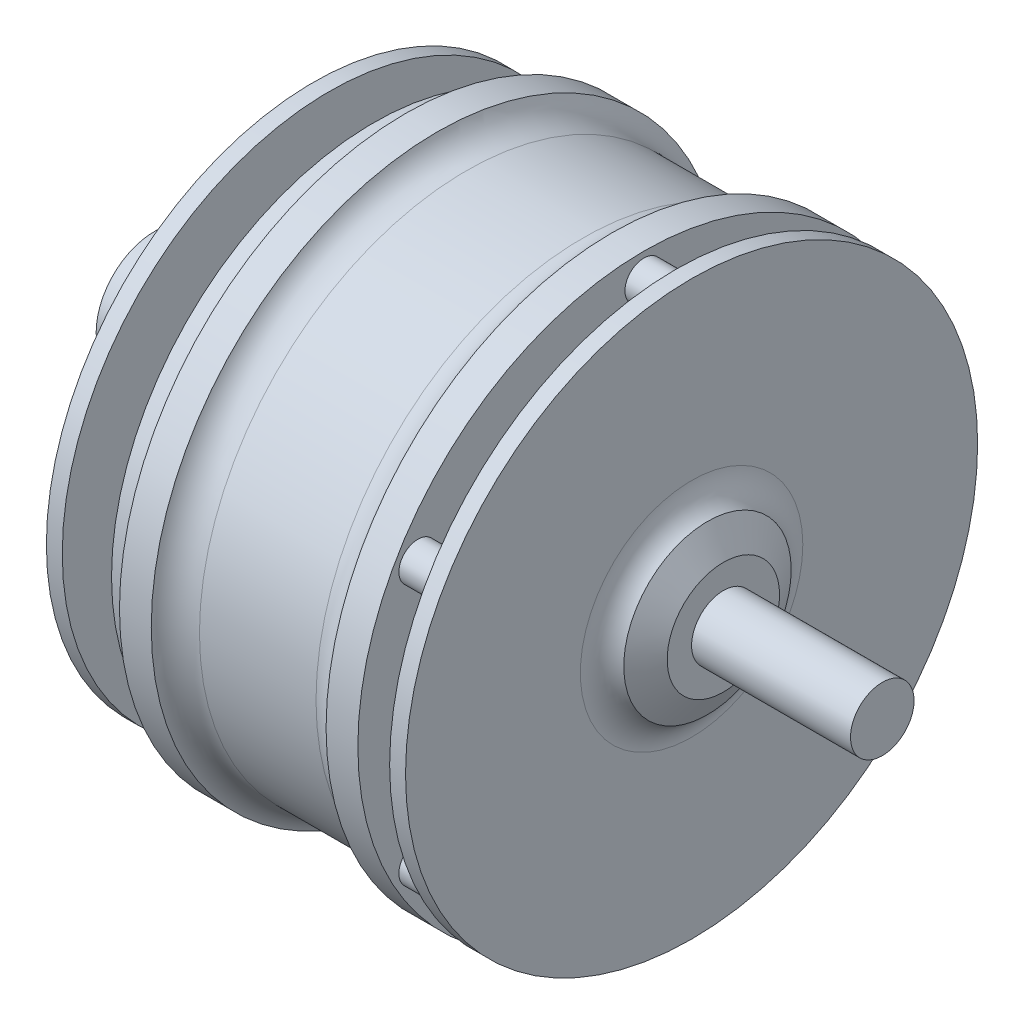
ISO-10303-21;
HEADER;
FILE_DESCRIPTION(('STEP AP214'),'2;1');
FILE_NAME('part.step','',(''),(''),'','','');
FILE_SCHEMA(('AUTOMOTIVE_DESIGN { 1 0 10303 214 1 1 1 1 }'));
ENDSEC;
DATA;
#1=APPLICATION_CONTEXT('core data for automotive mechanical design processes');
#2=APPLICATION_PROTOCOL_DEFINITION('international standard','automotive_design',2000,#1);
#3=PRODUCT_CONTEXT('',#1,'mechanical');
#4=PRODUCT('Part','Part','',(#3));
#5=PRODUCT_RELATED_PRODUCT_CATEGORY('part','',(#4));
#6=PRODUCT_DEFINITION_FORMATION('','',#4);
#7=PRODUCT_DEFINITION_CONTEXT('part definition',#1,'design');
#8=PRODUCT_DEFINITION('design','',#6,#7);
#9=PRODUCT_DEFINITION_SHAPE('','',#8);
#10=(LENGTH_UNIT() NAMED_UNIT(*) SI_UNIT(.MILLI.,.METRE.));
#11=(NAMED_UNIT(*) PLANE_ANGLE_UNIT() SI_UNIT($,.RADIAN.));
#12=(NAMED_UNIT(*) SI_UNIT($,.STERADIAN.) SOLID_ANGLE_UNIT());
#13=UNCERTAINTY_MEASURE_WITH_UNIT(LENGTH_MEASURE(1.E-05),#10,'distance_accuracy_value','');
#14=(GEOMETRIC_REPRESENTATION_CONTEXT(3) GLOBAL_UNCERTAINTY_ASSIGNED_CONTEXT((#13)) GLOBAL_UNIT_ASSIGNED_CONTEXT((#10,
#11,#12)) REPRESENTATION_CONTEXT('',''));
#15=CARTESIAN_POINT('',(0.,0.,0.));
#16=DIRECTION('',(0.,0.,1.));
#17=DIRECTION('',(1.,0.,0.));
#18=AXIS2_PLACEMENT_3D('',#15,#16,#17);
#19=CARTESIAN_POINT('',(90.,0.,0.));
#20=DIRECTION('',(1.,0.,0.));
#21=DIRECTION('',(0.,0.,-1.));
#22=AXIS2_PLACEMENT_3D('',#19,#20,#21);
#23=PLANE('',#22);
#24=CARTESIAN_POINT('',(90.,0.,0.));
#25=DIRECTION('',(1.,0.,0.));
#26=DIRECTION('',(0.,0.,-1.));
#27=AXIS2_PLACEMENT_3D('',#24,#25,#26);
#28=CIRCLE('',#27,17.6794919243111);
#29=CARTESIAN_POINT('',(90.,0.,-17.6794919243111));
#30=VERTEX_POINT('',#29);
#31=EDGE_CURVE('E44',#30,#30,#28,.T.);
#32=ORIENTED_EDGE('',*,*,#31,.T.);
#33=EDGE_LOOP('',(#32));
#34=FACE_BOUND('',#33,.T.);
#35=CARTESIAN_POINT('',(90.,0.,0.));
#36=DIRECTION('',(1.,0.,0.));
#37=DIRECTION('',(0.,0.,-1.));
#38=AXIS2_PLACEMENT_3D('',#35,#36,#37);
#39=CIRCLE('',#38,10.);
#40=CARTESIAN_POINT('',(90.,0.,-10.));
#41=VERTEX_POINT('',#40);
#42=EDGE_CURVE('E311',#41,#41,#39,.T.);
#43=ORIENTED_EDGE('',*,*,#42,.F.);
#44=EDGE_LOOP('',(#43));
#45=FACE_BOUND('',#44,.T.);
#46=ADVANCED_FACE('F37',(#34,#45),#23,.T.);
#47=CARTESIAN_POINT('',(80.,0.,0.));
#48=DIRECTION('',(1.,0.,0.));
#49=DIRECTION('',(0.,0.,-1.));
#50=AXIS2_PLACEMENT_3D('',#47,#48,#49);
#51=PLANE('',#50);
#52=CARTESIAN_POINT('',(80.,0.,0.));
#53=DIRECTION('',(1.,0.,0.));
#54=DIRECTION('',(0.,0.,-1.));
#55=AXIS2_PLACEMENT_3D('',#52,#53,#54);
#56=CIRCLE('',#55,35.);
#57=CARTESIAN_POINT('',(80.,0.,-35.));
#58=VERTEX_POINT('',#57);
#59=EDGE_CURVE('E48',#58,#58,#56,.F.);
#60=ORIENTED_EDGE('',*,*,#59,.T.);
#61=EDGE_LOOP('',(#60));
#62=FACE_BOUND('',#61,.T.);
#63=CARTESIAN_POINT('',(80.,0.,0.));
#64=DIRECTION('',(1.,0.,0.));
#65=DIRECTION('',(0.,0.,-1.));
#66=AXIS2_PLACEMENT_3D('',#63,#64,#65);
#67=CIRCLE('',#66,90.);
#68=CARTESIAN_POINT('',(80.,0.,-90.));
#69=VERTEX_POINT('',#68);
#70=EDGE_CURVE('E299',#69,#69,#67,.T.);
#71=ORIENTED_EDGE('',*,*,#70,.T.);
#72=EDGE_LOOP('',(#71));
#73=FACE_BOUND('',#72,.T.);
#74=ADVANCED_FACE('F130',(#62,#73),#51,.T.);
#75=CARTESIAN_POINT('',(65.,0.,0.));
#76=DIRECTION('',(1.,0.,0.));
#77=DIRECTION('',(0.,0.,-1.));
#78=AXIS2_PLACEMENT_3D('',#75,#76,#77);
#79=PLANE('',#78);
#80=CARTESIAN_POINT('',(65.,41.0613259833003,71.1203028292224));
#81=DIRECTION('',(1.,0.,0.));
#82=DIRECTION('',(0.,0.866025403784433,-0.50000000000001));
#83=AXIS2_PLACEMENT_3D('',#80,#81,#82);
#84=CIRCLE('',#83,5.96597399702664);
#85=CARTESIAN_POINT('',(65.,46.2280110230428,68.137315830709));
#86=VERTEX_POINT('',#85);
#87=EDGE_CURVE('E296',#86,#86,#84,.T.);
#88=ORIENTED_EDGE('',*,*,#87,.F.);
#89=EDGE_LOOP('',(#88));
#90=FACE_BOUND('',#89,.T.);
#91=CARTESIAN_POINT('',(65.,-82.122651966599,0.));
#92=DIRECTION('',(1.,0.,0.));
#93=DIRECTION('',(0.,0.,1.));
#94=AXIS2_PLACEMENT_3D('',#91,#92,#93);
#95=CIRCLE('',#94,5.96597399702664);
#96=CARTESIAN_POINT('',(65.,-82.122651966599,5.96597399702664));
#97=VERTEX_POINT('',#96);
#98=EDGE_CURVE('E284',#97,#97,#95,.T.);
#99=ORIENTED_EDGE('',*,*,#98,.F.);
#100=EDGE_LOOP('',(#99));
#101=FACE_BOUND('',#100,.T.);
#102=CARTESIAN_POINT('',(65.,41.0613259832993,-71.120302829223));
#103=DIRECTION('',(1.,0.,0.));
#104=DIRECTION('',(0.,-0.86602540378444,-0.499999999999998));
#105=AXIS2_PLACEMENT_3D('',#102,#103,#104);
#106=CIRCLE('',#105,5.96597399702664);
#107=CARTESIAN_POINT('',(65.,35.8946409435569,-74.1032898277363));
#108=VERTEX_POINT('',#107);
#109=EDGE_CURVE('E272',#108,#108,#106,.T.);
#110=ORIENTED_EDGE('',*,*,#109,.F.);
#111=EDGE_LOOP('',(#110));
#112=FACE_BOUND('',#111,.T.);
#113=CARTESIAN_POINT('',(65.,0.,0.));
#114=DIRECTION('',(1.,0.,0.));
#115=DIRECTION('',(0.,0.,-1.));
#116=AXIS2_PLACEMENT_3D('',#113,#114,#115);
#117=CIRCLE('',#116,90.);
#118=CARTESIAN_POINT('',(65.,0.,-90.));
#119=VERTEX_POINT('',#118);
#120=EDGE_CURVE('E63',#119,#119,#117,.T.);
#121=ORIENTED_EDGE('',*,*,#120,.T.);
#122=EDGE_LOOP('',(#121));
#123=FACE_BOUND('',#122,.T.);
#124=CARTESIAN_POINT('',(65.,82.122651966599,0.));
#125=DIRECTION('',(1.,0.,0.));
#126=DIRECTION('',(0.,0.,-1.));
#127=AXIS2_PLACEMENT_3D('',#124,#125,#126);
#128=CIRCLE('',#127,5.96597399702664);
#129=CARTESIAN_POINT('',(65.,82.122651966599,-5.96597399702664));
#130=VERTEX_POINT('',#129);
#131=EDGE_CURVE('E266',#130,#130,#128,.T.);
#132=ORIENTED_EDGE('',*,*,#131,.F.);
#133=EDGE_LOOP('',(#132));
#134=FACE_BOUND('',#133,.T.);
#135=CARTESIAN_POINT('',(65.,-41.0613259832999,-71.1203028292227));
#136=DIRECTION('',(1.,0.,0.));
#137=DIRECTION('',(0.,-0.866025403784436,0.500000000000004));
#138=AXIS2_PLACEMENT_3D('',#135,#136,#137);
#139=CIRCLE('',#138,5.96597399702664);
#140=CARTESIAN_POINT('',(65.,-46.2280110230423,-68.1373158307093));
#141=VERTEX_POINT('',#140);
#142=EDGE_CURVE('E278',#141,#141,#139,.T.);
#143=ORIENTED_EDGE('',*,*,#142,.F.);
#144=EDGE_LOOP('',(#143));
#145=FACE_BOUND('',#144,.T.);
#146=CARTESIAN_POINT('',(65.,-41.0613259832989,71.1203028292232));
#147=DIRECTION('',(1.,0.,0.));
#148=DIRECTION('',(0.,0.866025403784443,0.499999999999992));
#149=AXIS2_PLACEMENT_3D('',#146,#147,#148);
#150=CIRCLE('',#149,5.96597399702664);
#151=CARTESIAN_POINT('',(65.,-35.8946409435564,74.1032898277365));
#152=VERTEX_POINT('',#151);
#153=EDGE_CURVE('E290',#152,#152,#150,.T.);
#154=ORIENTED_EDGE('',*,*,#153,.F.);
#155=EDGE_LOOP('',(#154));
#156=FACE_BOUND('',#155,.T.);
#157=CARTESIAN_POINT('',(65.,0.,0.));
#158=DIRECTION('',(1.,0.,0.));
#159=DIRECTION('',(0.,0.,-1.));
#160=AXIS2_PLACEMENT_3D('',#157,#158,#159);
#161=CIRCLE('',#160,25.);
#162=CARTESIAN_POINT('',(65.,0.,-25.));
#163=VERTEX_POINT('',#162);
#164=EDGE_CURVE('E305',#163,#163,#161,.T.);
#165=ORIENTED_EDGE('',*,*,#164,.F.);
#166=EDGE_LOOP('',(#165));
#167=FACE_BOUND('',#166,.T.);
#168=ADVANCED_FACE('F126',(#90,#101,#112,#123,#134,#145,#156,#167),#79,.T.);
#169=CARTESIAN_POINT('',(75.,0.,0.));
#170=DIRECTION('',(1.,0.,0.));
#171=DIRECTION('',(0.,0.,-1.));
#172=AXIS2_PLACEMENT_3D('',#169,#170,#171);
#173=PLANE('',#172);
#174=CARTESIAN_POINT('',(75.,82.122651966599,0.));
#175=DIRECTION('',(1.,0.,0.));
#176=DIRECTION('',(0.,0.,-1.));
#177=AXIS2_PLACEMENT_3D('',#174,#175,#176);
#178=CIRCLE('',#177,5.96597399702664);
#179=CARTESIAN_POINT('',(75.,82.122651966599,-5.96597399702664));
#180=VERTEX_POINT('',#179);
#181=EDGE_CURVE('E263',#180,#180,#178,.T.);
#182=ORIENTED_EDGE('',*,*,#181,.T.);
#183=EDGE_LOOP('',(#182));
#184=FACE_BOUND('',#183,.T.);
#185=CARTESIAN_POINT('',(75.,-41.0613259832999,-71.1203028292227));
#186=DIRECTION('',(1.,0.,0.));
#187=DIRECTION('',(0.,-0.866025403784436,0.500000000000004));
#188=AXIS2_PLACEMENT_3D('',#185,#186,#187);
#189=CIRCLE('',#188,5.96597399702664);
#190=CARTESIAN_POINT('',(75.,-46.2280110230423,-68.1373158307093));
#191=VERTEX_POINT('',#190);
#192=EDGE_CURVE('E275',#191,#191,#189,.T.);
#193=ORIENTED_EDGE('',*,*,#192,.T.);
#194=EDGE_LOOP('',(#193));
#195=FACE_BOUND('',#194,.T.);
#196=CARTESIAN_POINT('',(75.,-41.0613259832989,71.1203028292232));
#197=DIRECTION('',(1.,0.,0.));
#198=DIRECTION('',(0.,0.866025403784443,0.499999999999992));
#199=AXIS2_PLACEMENT_3D('',#196,#197,#198);
#200=CIRCLE('',#199,5.96597399702664);
#201=CARTESIAN_POINT('',(75.,-35.8946409435564,74.1032898277365));
#202=VERTEX_POINT('',#201);
#203=EDGE_CURVE('E287',#202,#202,#200,.T.);
#204=ORIENTED_EDGE('',*,*,#203,.T.);
#205=EDGE_LOOP('',(#204));
#206=FACE_BOUND('',#205,.T.);
#207=CARTESIAN_POINT('',(75.,0.,0.));
#208=DIRECTION('',(1.,0.,0.));
#209=DIRECTION('',(0.,0.,-1.));
#210=AXIS2_PLACEMENT_3D('',#207,#208,#209);
#211=CIRCLE('',#210,90.);
#212=CARTESIAN_POINT('',(75.,0.,-90.));
#213=VERTEX_POINT('',#212);
#214=EDGE_CURVE('E302',#213,#213,#211,.T.);
#215=ORIENTED_EDGE('',*,*,#214,.F.);
#216=EDGE_LOOP('',(#215));
#217=FACE_BOUND('',#216,.T.);
#218=CARTESIAN_POINT('',(75.,41.0613259833003,71.1203028292224));
#219=DIRECTION('',(1.,0.,0.));
#220=DIRECTION('',(0.,0.866025403784433,-0.50000000000001));
#221=AXIS2_PLACEMENT_3D('',#218,#219,#220);
#222=CIRCLE('',#221,5.96597399702664);
#223=CARTESIAN_POINT('',(75.,46.2280110230428,68.137315830709));
#224=VERTEX_POINT('',#223);
#225=EDGE_CURVE('E293',#224,#224,#222,.T.);
#226=ORIENTED_EDGE('',*,*,#225,.T.);
#227=EDGE_LOOP('',(#226));
#228=FACE_BOUND('',#227,.T.);
#229=CARTESIAN_POINT('',(75.,-82.122651966599,0.));
#230=DIRECTION('',(1.,0.,0.));
#231=DIRECTION('',(0.,0.,1.));
#232=AXIS2_PLACEMENT_3D('',#229,#230,#231);
#233=CIRCLE('',#232,5.96597399702664);
#234=CARTESIAN_POINT('',(75.,-82.122651966599,5.96597399702664));
#235=VERTEX_POINT('',#234);
#236=EDGE_CURVE('E281',#235,#235,#233,.T.);
#237=ORIENTED_EDGE('',*,*,#236,.T.);
#238=EDGE_LOOP('',(#237));
#239=FACE_BOUND('',#238,.T.);
#240=CARTESIAN_POINT('',(75.,41.0613259832993,-71.120302829223));
#241=DIRECTION('',(1.,0.,0.));
#242=DIRECTION('',(0.,-0.86602540378444,-0.499999999999998));
#243=AXIS2_PLACEMENT_3D('',#240,#241,#242);
#244=CIRCLE('',#243,5.96597399702664);
#245=CARTESIAN_POINT('',(75.,35.8946409435569,-74.1032898277363));
#246=VERTEX_POINT('',#245);
#247=EDGE_CURVE('E269',#246,#246,#244,.T.);
#248=ORIENTED_EDGE('',*,*,#247,.T.);
#249=EDGE_LOOP('',(#248));
#250=FACE_BOUND('',#249,.T.);
#251=CARTESIAN_POINT('',(75.,0.,0.));
#252=DIRECTION('',(1.,0.,0.));
#253=DIRECTION('',(0.,0.,-1.));
#254=AXIS2_PLACEMENT_3D('',#251,#252,#253);
#255=CIRCLE('',#254,25.);
#256=CARTESIAN_POINT('',(75.,0.,-25.));
#257=VERTEX_POINT('',#256);
#258=EDGE_CURVE('E60',#257,#257,#255,.F.);
#259=ORIENTED_EDGE('',*,*,#258,.F.);
#260=EDGE_LOOP('',(#259));
#261=FACE_BOUND('',#260,.T.);
#262=ADVANCED_FACE('F129',(#184,#195,#206,#217,#228,#239,#250,#261),#173,.F.);
#263=CARTESIAN_POINT('',(-39.,0.,0.));
#264=DIRECTION('',(-1.,0.,0.));
#265=DIRECTION('',(0.,0.,1.));
#266=AXIS2_PLACEMENT_3D('',#263,#264,#265);
#267=PLANE('',#266);
#268=CARTESIAN_POINT('',(-39.,0.,0.));
#269=DIRECTION('',(-1.,0.,0.));
#270=DIRECTION('',(0.,0.,1.));
#271=AXIS2_PLACEMENT_3D('',#268,#269,#270);
#272=CIRCLE('',#271,84.);
#273=CARTESIAN_POINT('',(-39.,0.,84.));
#274=VERTEX_POINT('',#273);
#275=EDGE_CURVE('E236',#274,#274,#272,.T.);
#276=ORIENTED_EDGE('',*,*,#275,.T.);
#277=EDGE_LOOP('',(#276));
#278=FACE_BOUND('',#277,.T.);
#279=CARTESIAN_POINT('',(-39.,0.,0.));
#280=DIRECTION('',(-1.,0.,0.));
#281=DIRECTION('',(0.,0.,1.));
#282=AXIS2_PLACEMENT_3D('',#279,#280,#281);
#283=CIRCLE('',#282,18.3359588018754);
#284=CARTESIAN_POINT('',(-39.,0.,18.3359588018754));
#285=VERTEX_POINT('',#284);
#286=EDGE_CURVE('E260',#285,#285,#283,.T.);
#287=ORIENTED_EDGE('',*,*,#286,.F.);
#288=EDGE_LOOP('',(#287));
#289=FACE_BOUND('',#288,.T.);
#290=ADVANCED_FACE('F104',(#278,#289),#267,.T.);
#291=CARTESIAN_POINT('',(-29.,0.,0.));
#292=DIRECTION('',(-1.,0.,0.));
#293=DIRECTION('',(0.,0.,1.));
#294=AXIS2_PLACEMENT_3D('',#291,#292,#293);
#295=PLANE('',#294);
#296=CARTESIAN_POINT('',(-29.,0.,0.));
#297=DIRECTION('',(-1.,0.,0.));
#298=DIRECTION('',(0.,0.,1.));
#299=AXIS2_PLACEMENT_3D('',#296,#297,#298);
#300=CIRCLE('',#299,45.);
#301=CARTESIAN_POINT('',(-29.,0.,45.));
#302=VERTEX_POINT('',#301);
#303=EDGE_CURVE('E84',#302,#302,#300,.T.);
#304=ORIENTED_EDGE('',*,*,#303,.T.);
#305=EDGE_LOOP('',(#304));
#306=FACE_BOUND('',#305,.T.);
#307=CARTESIAN_POINT('',(-29.,0.,0.));
#308=DIRECTION('',(-1.,0.,0.));
#309=DIRECTION('',(0.,0.,1.));
#310=AXIS2_PLACEMENT_3D('',#307,#308,#309);
#311=CIRCLE('',#310,15.);
#312=CARTESIAN_POINT('',(-29.,0.,15.));
#313=VERTEX_POINT('',#312);
#314=EDGE_CURVE('E234',#313,#313,#311,.T.);
#315=ORIENTED_EDGE('',*,*,#314,.F.);
#316=EDGE_LOOP('',(#315));
#317=FACE_BOUND('',#316,.T.);
#318=ADVANCED_FACE('F93',(#306,#317),#295,.T.);
#319=CARTESIAN_POINT('',(-20.,0.,0.));
#320=DIRECTION('',(-1.,0.,0.));
#321=DIRECTION('',(0.,0.,1.));
#322=AXIS2_PLACEMENT_3D('',#319,#320,#321);
#323=PLANE('',#322);
#324=CARTESIAN_POINT('',(-20.,0.,0.));
#325=DIRECTION('',(-1.,0.,0.));
#326=DIRECTION('',(0.,0.,1.));
#327=AXIS2_PLACEMENT_3D('',#324,#325,#326);
#328=CIRCLE('',#327,82.5);
#329=CARTESIAN_POINT('',(-20.,0.,82.5));
#330=VERTEX_POINT('',#329);
#331=EDGE_CURVE('E73',#330,#330,#328,.T.);
#332=ORIENTED_EDGE('',*,*,#331,.T.);
#333=EDGE_LOOP('',(#332));
#334=FACE_BOUND('',#333,.T.);
#335=CARTESIAN_POINT('',(-20.,0.,0.));
#336=DIRECTION('',(-1.,0.,0.));
#337=DIRECTION('',(0.,0.,1.));
#338=AXIS2_PLACEMENT_3D('',#335,#336,#337);
#339=CIRCLE('',#338,62.5);
#340=CARTESIAN_POINT('',(-20.,0.,62.5));
#341=VERTEX_POINT('',#340);
#342=EDGE_CURVE('E79',#341,#341,#339,.T.);
#343=ORIENTED_EDGE('',*,*,#342,.F.);
#344=EDGE_LOOP('',(#343));
#345=FACE_BOUND('',#344,.T.);
#346=ADVANCED_FACE('F103',(#334,#345),#323,.T.);
#347=CARTESIAN_POINT('',(-10.,0.,0.));
#348=DIRECTION('',(-1.,0.,0.));
#349=DIRECTION('',(0.,0.,1.));
#350=AXIS2_PLACEMENT_3D('',#347,#348,#349);
#351=PLANE('',#350);
#352=CARTESIAN_POINT('',(-10.,0.,0.));
#353=DIRECTION('',(-1.,0.,0.));
#354=DIRECTION('',(0.,0.,1.));
#355=AXIS2_PLACEMENT_3D('',#352,#353,#354);
#356=CIRCLE('',#355,90.);
#357=CARTESIAN_POINT('',(-10.,0.,90.));
#358=VERTEX_POINT('',#357);
#359=EDGE_CURVE('E67',#358,#358,#356,.T.);
#360=ORIENTED_EDGE('',*,*,#359,.T.);
#361=EDGE_LOOP('',(#360));
#362=FACE_BOUND('',#361,.T.);
#363=CARTESIAN_POINT('',(-10.,0.,0.));
#364=DIRECTION('',(-1.,0.,0.));
#365=DIRECTION('',(0.,0.,1.));
#366=AXIS2_PLACEMENT_3D('',#363,#364,#365);
#367=CIRCLE('',#366,82.5);
#368=CARTESIAN_POINT('',(-10.,0.,82.5));
#369=VERTEX_POINT('',#368);
#370=EDGE_CURVE('E76',#369,#369,#367,.T.);
#371=ORIENTED_EDGE('',*,*,#370,.F.);
#372=EDGE_LOOP('',(#371));
#373=FACE_BOUND('',#372,.T.);
#374=ADVANCED_FACE('F111',(#362,#373),#351,.T.);
#375=CARTESIAN_POINT('',(55.,0.,0.));
#376=DIRECTION('',(-1.,0.,0.));
#377=DIRECTION('',(0.,0.,1.));
#378=AXIS2_PLACEMENT_3D('',#375,#376,#377);
#379=CYLINDRICAL_SURFACE('',#378,84.);
#380=CARTESIAN_POINT('',(45.8348486100883,0.,0.));
#381=DIRECTION('',(1.,0.,0.));
#382=DIRECTION('',(0.,0.,-1.));
#383=AXIS2_PLACEMENT_3D('',#380,#381,#382);
#384=CIRCLE('',#383,84.);
#385=CARTESIAN_POINT('',(45.8348486100883,0.,-84.));
#386=VERTEX_POINT('',#385);
#387=EDGE_CURVE('E52',#386,#386,#384,.F.);
#388=ORIENTED_EDGE('',*,*,#387,.T.);
#389=EDGE_LOOP('',(#388));
#390=FACE_BOUND('',#389,.T.);
#391=CARTESIAN_POINT('',(9.16515138991168,0.,0.));
#392=DIRECTION('',(-1.,0.,0.));
#393=DIRECTION('',(0.,0.,1.));
#394=AXIS2_PLACEMENT_3D('',#391,#392,#393);
#395=CIRCLE('',#394,84.);
#396=CARTESIAN_POINT('',(9.16515138991168,0.,84.));
#397=VERTEX_POINT('',#396);
#398=EDGE_CURVE('E57',#397,#397,#395,.F.);
#399=ORIENTED_EDGE('',*,*,#398,.T.);
#400=EDGE_LOOP('',(#399));
#401=FACE_BOUND('',#400,.T.);
#402=ADVANCED_FACE('F120',(#390,#401),#379,.T.);
#403=CARTESIAN_POINT('',(65.,0.,0.));
#404=DIRECTION('',(-1.,0.,0.));
#405=DIRECTION('',(0.,0.,1.));
#406=AXIS2_PLACEMENT_3D('',#403,#404,#405);
#407=CYLINDRICAL_SURFACE('',#406,90.);
#408=ORIENTED_EDGE('',*,*,#120,.F.);
#409=EDGE_LOOP('',(#408));
#410=FACE_BOUND('',#409,.T.);
#411=CARTESIAN_POINT('',(55.,0.,0.));
#412=DIRECTION('',(1.,0.,0.));
#413=DIRECTION('',(0.,0.,-1.));
#414=AXIS2_PLACEMENT_3D('',#411,#412,#413);
#415=CIRCLE('',#414,90.);
#416=CARTESIAN_POINT('',(55.,0.,-90.));
#417=VERTEX_POINT('',#416);
#418=EDGE_CURVE('E64',#417,#417,#415,.T.);
#419=ORIENTED_EDGE('',*,*,#418,.T.);
#420=EDGE_LOOP('',(#419));
#421=FACE_BOUND('',#420,.T.);
#422=ADVANCED_FACE('F124',(#410,#421),#407,.T.);
#423=CARTESIAN_POINT('',(-10.,0.,0.));
#424=DIRECTION('',(1.,0.,0.));
#425=DIRECTION('',(0.,0.,-1.));
#426=AXIS2_PLACEMENT_3D('',#423,#424,#425);
#427=CYLINDRICAL_SURFACE('',#426,90.);
#428=ORIENTED_EDGE('',*,*,#359,.F.);
#429=EDGE_LOOP('',(#428));
#430=FACE_BOUND('',#429,.T.);
#431=CARTESIAN_POINT('',(0.,0.,0.));
#432=DIRECTION('',(-1.,0.,0.));
#433=DIRECTION('',(0.,0.,1.));
#434=AXIS2_PLACEMENT_3D('',#431,#432,#433);
#435=CIRCLE('',#434,90.);
#436=CARTESIAN_POINT('',(0.,0.,90.));
#437=VERTEX_POINT('',#436);
#438=EDGE_CURVE('E70',#437,#437,#435,.T.);
#439=ORIENTED_EDGE('',*,*,#438,.T.);
#440=EDGE_LOOP('',(#439));
#441=FACE_BOUND('',#440,.T.);
#442=ADVANCED_FACE('F116',(#430,#441),#427,.T.);
#443=CARTESIAN_POINT('',(-20.,0.,0.));
#444=DIRECTION('',(1.,0.,0.));
#445=DIRECTION('',(0.,0.,-1.));
#446=AXIS2_PLACEMENT_3D('',#443,#444,#445);
#447=CYLINDRICAL_SURFACE('',#446,82.5);
#448=ORIENTED_EDGE('',*,*,#331,.F.);
#449=EDGE_LOOP('',(#448));
#450=FACE_BOUND('',#449,.T.);
#451=ORIENTED_EDGE('',*,*,#370,.T.);
#452=EDGE_LOOP('',(#451));
#453=FACE_BOUND('',#452,.T.);
#454=ADVANCED_FACE('F113',(#450,#453),#447,.T.);
#455=CARTESIAN_POINT('',(-29.,0.,0.));
#456=DIRECTION('',(1.,0.,0.));
#457=DIRECTION('',(0.,0.,-1.));
#458=AXIS2_PLACEMENT_3D('',#455,#456,#457);
#459=CONICAL_SURFACE('',#458,45.,1.0957855705298);
#460=ORIENTED_EDGE('',*,*,#342,.T.);
#461=EDGE_LOOP('',(#460));
#462=FACE_BOUND('',#461,.T.);
#463=ORIENTED_EDGE('',*,*,#303,.F.);
#464=EDGE_LOOP('',(#463));
#465=FACE_BOUND('',#464,.T.);
#466=ADVANCED_FACE('F106',(#462,#465),#459,.T.);
#467=CARTESIAN_POINT('',(-34.,0.,0.));
#468=DIRECTION('',(1.,0.,0.));
#469=DIRECTION('',(0.,0.,-1.));
#470=AXIS2_PLACEMENT_3D('',#467,#468,#469);
#471=CYLINDRICAL_SURFACE('',#470,15.);
#472=CARTESIAN_POINT('',(-34.,0.,0.));
#473=DIRECTION('',(-1.,0.,0.));
#474=DIRECTION('',(0.,0.,1.));
#475=AXIS2_PLACEMENT_3D('',#472,#473,#474);
#476=CIRCLE('',#475,15.);
#477=CARTESIAN_POINT('',(-34.,0.,15.));
#478=VERTEX_POINT('',#477);
#479=EDGE_CURVE('E87',#478,#478,#476,.T.);
#480=ORIENTED_EDGE('',*,*,#479,.F.);
#481=EDGE_LOOP('',(#480));
#482=FACE_BOUND('',#481,.T.);
#483=ORIENTED_EDGE('',*,*,#314,.T.);
#484=EDGE_LOOP('',(#483));
#485=FACE_BOUND('',#484,.T.);
#486=ADVANCED_FACE('F219',(#482,#485),#471,.T.);
#487=CARTESIAN_POINT('',(-34.,0.,0.));
#488=DIRECTION('',(-1.,0.,0.));
#489=DIRECTION('',(0.,0.,1.));
#490=AXIS2_PLACEMENT_3D('',#487,#488,#489);
#491=PLANE('',#490);
#492=CARTESIAN_POINT('',(-34.,0.,0.));
#493=DIRECTION('',(-1.,0.,0.));
#494=DIRECTION('',(0.,0.,1.));
#495=AXIS2_PLACEMENT_3D('',#492,#493,#494);
#496=CIRCLE('',#495,84.);
#497=CARTESIAN_POINT('',(-34.,0.,84.));
#498=VERTEX_POINT('',#497);
#499=EDGE_CURVE('E240',#498,#498,#496,.T.);
#500=ORIENTED_EDGE('',*,*,#499,.F.);
#501=EDGE_LOOP('',(#500));
#502=FACE_BOUND('',#501,.T.);
#503=ORIENTED_EDGE('',*,*,#479,.T.);
#504=EDGE_LOOP('',(#503));
#505=FACE_BOUND('',#504,.T.);
#506=ADVANCED_FACE('F216',(#502,#505),#491,.F.);
#507=CARTESIAN_POINT('',(-39.,0.,0.));
#508=DIRECTION('',(1.,0.,0.));
#509=DIRECTION('',(0.,0.,-1.));
#510=AXIS2_PLACEMENT_3D('',#507,#508,#509);
#511=CYLINDRICAL_SURFACE('',#510,84.);
#512=ORIENTED_EDGE('',*,*,#275,.F.);
#513=EDGE_LOOP('',(#512));
#514=FACE_BOUND('',#513,.T.);
#515=ORIENTED_EDGE('',*,*,#499,.T.);
#516=EDGE_LOOP('',(#515));
#517=FACE_BOUND('',#516,.T.);
#518=ADVANCED_FACE('F211',(#514,#517),#511,.T.);
#519=CARTESIAN_POINT('',(-89.,0.,0.));
#520=DIRECTION('',(1.,0.,0.));
#521=DIRECTION('',(0.,0.,-1.));
#522=AXIS2_PLACEMENT_3D('',#519,#520,#521);
#523=CYLINDRICAL_SURFACE('',#522,18.3359588018754);
#524=CARTESIAN_POINT('',(-89.,0.,0.));
#525=DIRECTION('',(-1.,0.,0.));
#526=DIRECTION('',(0.,0.,1.));
#527=AXIS2_PLACEMENT_3D('',#524,#525,#526);
#528=CIRCLE('',#527,18.3359588018754);
#529=CARTESIAN_POINT('',(-89.,0.,18.3359588018754));
#530=VERTEX_POINT('',#529);
#531=EDGE_CURVE('E258',#530,#530,#528,.T.);
#532=ORIENTED_EDGE('',*,*,#531,.F.);
#533=EDGE_LOOP('',(#532));
#534=FACE_BOUND('',#533,.T.);
#535=ORIENTED_EDGE('',*,*,#286,.T.);
#536=EDGE_LOOP('',(#535));
#537=FACE_BOUND('',#536,.T.);
#538=ADVANCED_FACE('F207',(#534,#537),#523,.T.);
#539=CARTESIAN_POINT('',(-89.,0.,0.));
#540=DIRECTION('',(-1.,0.,0.));
#541=DIRECTION('',(0.,0.,1.));
#542=AXIS2_PLACEMENT_3D('',#539,#540,#541);
#543=PLANE('',#542);
#544=ORIENTED_EDGE('',*,*,#531,.T.);
#545=EDGE_LOOP('',(#544));
#546=FACE_BOUND('',#545,.T.);
#547=ADVANCED_FACE('F203',(#546),#543,.T.);
#548=CARTESIAN_POINT('',(75.,82.122651966599,0.));
#549=DIRECTION('',(-1.,0.,0.));
#550=DIRECTION('',(0.,0.,1.));
#551=AXIS2_PLACEMENT_3D('',#548,#549,#550);
#552=CYLINDRICAL_SURFACE('',#551,5.96597399702664);
#553=ORIENTED_EDGE('',*,*,#181,.F.);
#554=EDGE_LOOP('',(#553));
#555=FACE_BOUND('',#554,.T.);
#556=ORIENTED_EDGE('',*,*,#131,.T.);
#557=EDGE_LOOP('',(#556));
#558=FACE_BOUND('',#557,.T.);
#559=ADVANCED_FACE('F199',(#555,#558),#552,.T.);
#560=CARTESIAN_POINT('',(75.,41.0613259832993,-71.120302829223));
#561=DIRECTION('',(-1.,0.,0.));
#562=DIRECTION('',(0.,0.,1.));
#563=AXIS2_PLACEMENT_3D('',#560,#561,#562);
#564=CYLINDRICAL_SURFACE('',#563,5.96597399702664);
#565=ORIENTED_EDGE('',*,*,#247,.F.);
#566=EDGE_LOOP('',(#565));
#567=FACE_BOUND('',#566,.T.);
#568=ORIENTED_EDGE('',*,*,#109,.T.);
#569=EDGE_LOOP('',(#568));
#570=FACE_BOUND('',#569,.T.);
#571=ADVANCED_FACE('F195',(#567,#570),#564,.T.);
#572=CARTESIAN_POINT('',(75.,-41.0613259832999,-71.1203028292227));
#573=DIRECTION('',(-1.,0.,0.));
#574=DIRECTION('',(0.,0.,1.));
#575=AXIS2_PLACEMENT_3D('',#572,#573,#574);
#576=CYLINDRICAL_SURFACE('',#575,5.96597399702664);
#577=ORIENTED_EDGE('',*,*,#192,.F.);
#578=EDGE_LOOP('',(#577));
#579=FACE_BOUND('',#578,.T.);
#580=ORIENTED_EDGE('',*,*,#142,.T.);
#581=EDGE_LOOP('',(#580));
#582=FACE_BOUND('',#581,.T.);
#583=ADVANCED_FACE('F191',(#579,#582),#576,.T.);
#584=CARTESIAN_POINT('',(75.,-82.122651966599,0.));
#585=DIRECTION('',(-1.,0.,0.));
#586=DIRECTION('',(0.,0.,1.));
#587=AXIS2_PLACEMENT_3D('',#584,#585,#586);
#588=CYLINDRICAL_SURFACE('',#587,5.96597399702664);
#589=ORIENTED_EDGE('',*,*,#236,.F.);
#590=EDGE_LOOP('',(#589));
#591=FACE_BOUND('',#590,.T.);
#592=ORIENTED_EDGE('',*,*,#98,.T.);
#593=EDGE_LOOP('',(#592));
#594=FACE_BOUND('',#593,.T.);
#595=ADVANCED_FACE('F187',(#591,#594),#588,.T.);
#596=CARTESIAN_POINT('',(75.,-41.0613259832989,71.1203028292232));
#597=DIRECTION('',(-1.,0.,0.));
#598=DIRECTION('',(0.,0.,1.));
#599=AXIS2_PLACEMENT_3D('',#596,#597,#598);
#600=CYLINDRICAL_SURFACE('',#599,5.96597399702664);
#601=ORIENTED_EDGE('',*,*,#203,.F.);
#602=EDGE_LOOP('',(#601));
#603=FACE_BOUND('',#602,.T.);
#604=ORIENTED_EDGE('',*,*,#153,.T.);
#605=EDGE_LOOP('',(#604));
#606=FACE_BOUND('',#605,.T.);
#607=ADVANCED_FACE('F183',(#603,#606),#600,.T.);
#608=CARTESIAN_POINT('',(75.,41.0613259833003,71.1203028292224));
#609=DIRECTION('',(-1.,0.,0.));
#610=DIRECTION('',(0.,0.,1.));
#611=AXIS2_PLACEMENT_3D('',#608,#609,#610);
#612=CYLINDRICAL_SURFACE('',#611,5.96597399702664);
#613=ORIENTED_EDGE('',*,*,#225,.F.);
#614=EDGE_LOOP('',(#613));
#615=FACE_BOUND('',#614,.T.);
#616=ORIENTED_EDGE('',*,*,#87,.T.);
#617=EDGE_LOOP('',(#616));
#618=FACE_BOUND('',#617,.T.);
#619=ADVANCED_FACE('F179',(#615,#618),#612,.T.);
#620=CARTESIAN_POINT('',(80.,0.,0.));
#621=DIRECTION('',(-1.,0.,0.));
#622=DIRECTION('',(0.,0.,1.));
#623=AXIS2_PLACEMENT_3D('',#620,#621,#622);
#624=CYLINDRICAL_SURFACE('',#623,90.);
#625=ORIENTED_EDGE('',*,*,#70,.F.);
#626=EDGE_LOOP('',(#625));
#627=FACE_BOUND('',#626,.T.);
#628=ORIENTED_EDGE('',*,*,#214,.T.);
#629=EDGE_LOOP('',(#628));
#630=FACE_BOUND('',#629,.T.);
#631=ADVANCED_FACE('F171',(#627,#630),#624,.T.);
#632=CARTESIAN_POINT('',(75.,0.,0.));
#633=DIRECTION('',(-1.,0.,0.));
#634=DIRECTION('',(0.,0.,1.));
#635=AXIS2_PLACEMENT_3D('',#632,#633,#634);
#636=CYLINDRICAL_SURFACE('',#635,25.);
#637=ORIENTED_EDGE('',*,*,#258,.T.);
#638=EDGE_LOOP('',(#637));
#639=FACE_BOUND('',#638,.T.);
#640=ORIENTED_EDGE('',*,*,#164,.T.);
#641=EDGE_LOOP('',(#640));
#642=FACE_BOUND('',#641,.T.);
#643=ADVANCED_FACE('F142',(#639,#642),#636,.T.);
#644=CARTESIAN_POINT('',(9.16515138991168,0.,0.));
#645=DIRECTION('',(-1.,0.,0.));
#646=DIRECTION('',(0.,0.,1.));
#647=AXIS2_PLACEMENT_3D('',#644,#645,#646);
#648=TOROIDAL_SURFACE('',#647,94.,10.);
#649=ORIENTED_EDGE('',*,*,#398,.F.);
#650=EDGE_LOOP('',(#649));
#651=FACE_BOUND('',#650,.T.);
#652=ORIENTED_EDGE('',*,*,#438,.F.);
#653=EDGE_LOOP('',(#652));
#654=FACE_BOUND('',#653,.T.);
#655=ADVANCED_FACE('F138',(#651,#654),#648,.F.);
#656=CARTESIAN_POINT('',(45.8348486100883,0.,0.));
#657=DIRECTION('',(1.,0.,0.));
#658=DIRECTION('',(0.,0.,-1.));
#659=AXIS2_PLACEMENT_3D('',#656,#657,#658);
#660=TOROIDAL_SURFACE('',#659,94.,10.);
#661=ORIENTED_EDGE('',*,*,#387,.F.);
#662=EDGE_LOOP('',(#661));
#663=FACE_BOUND('',#662,.T.);
#664=ORIENTED_EDGE('',*,*,#418,.F.);
#665=EDGE_LOOP('',(#664));
#666=FACE_BOUND('',#665,.T.);
#667=ADVANCED_FACE('F141',(#663,#666),#660,.F.);
#668=CARTESIAN_POINT('',(140.,0.,0.));
#669=DIRECTION('',(-1.,0.,0.));
#670=DIRECTION('',(0.,0.,1.));
#671=AXIS2_PLACEMENT_3D('',#668,#669,#670);
#672=CYLINDRICAL_SURFACE('',#671,10.);
#673=CARTESIAN_POINT('',(140.,0.,0.));
#674=DIRECTION('',(1.,0.,0.));
#675=DIRECTION('',(0.,0.,-1.));
#676=AXIS2_PLACEMENT_3D('',#673,#674,#675);
#677=CIRCLE('',#676,10.);
#678=CARTESIAN_POINT('',(140.,0.,-10.));
#679=VERTEX_POINT('',#678);
#680=EDGE_CURVE('E310',#679,#679,#677,.T.);
#681=ORIENTED_EDGE('',*,*,#680,.F.);
#682=EDGE_LOOP('',(#681));
#683=FACE_BOUND('',#682,.T.);
#684=ORIENTED_EDGE('',*,*,#42,.T.);
#685=EDGE_LOOP('',(#684));
#686=FACE_BOUND('',#685,.T.);
#687=ADVANCED_FACE('F145',(#683,#686),#672,.T.);
#688=CARTESIAN_POINT('',(140.,0.,0.));
#689=DIRECTION('',(1.,0.,0.));
#690=DIRECTION('',(0.,0.,-1.));
#691=AXIS2_PLACEMENT_3D('',#688,#689,#690);
#692=PLANE('',#691);
#693=ORIENTED_EDGE('',*,*,#680,.T.);
#694=EDGE_LOOP('',(#693));
#695=FACE_BOUND('',#694,.T.);
#696=ADVANCED_FACE('F149',(#695),#692,.T.);
#697=CARTESIAN_POINT('',(90.,0.,0.));
#698=DIRECTION('',(1.,0.,0.));
#699=DIRECTION('',(0.,0.,-1.));
#700=AXIS2_PLACEMENT_3D('',#697,#698,#699);
#701=TOROIDAL_SURFACE('',#700,35.,10.);
#702=CARTESIAN_POINT('',(85.,0.,0.));
#703=DIRECTION('',(1.,0.,0.));
#704=DIRECTION('',(0.,0.,-1.));
#705=AXIS2_PLACEMENT_3D('',#702,#703,#704);
#706=CIRCLE('',#705,26.3397459621556);
#707=CARTESIAN_POINT('',(85.,0.,-26.3397459621556));
#708=VERTEX_POINT('',#707);
#709=EDGE_CURVE('E11',#708,#708,#706,.F.);
#710=ORIENTED_EDGE('',*,*,#709,.T.);
#711=EDGE_LOOP('',(#710));
#712=FACE_BOUND('',#711,.T.);
#713=ORIENTED_EDGE('',*,*,#59,.F.);
#714=EDGE_LOOP('',(#713));
#715=FACE_BOUND('',#714,.T.);
#716=ADVANCED_FACE('F147',(#712,#715),#701,.F.);
#717=CARTESIAN_POINT('',(90.,0.,0.));
#718=DIRECTION('',(-1.,0.,0.));
#719=DIRECTION('',(0.,0.,1.));
#720=AXIS2_PLACEMENT_3D('',#717,#718,#719);
#721=CONICAL_SURFACE('',#720,17.6794919243111,1.04719755119661);
#722=ORIENTED_EDGE('',*,*,#709,.F.);
#723=EDGE_LOOP('',(#722));
#724=FACE_BOUND('',#723,.T.);
#725=ORIENTED_EDGE('',*,*,#31,.F.);
#726=EDGE_LOOP('',(#725));
#727=FACE_BOUND('',#726,.T.);
#728=ADVANCED_FACE('F39',(#724,#727),#721,.T.);
#729=CLOSED_SHELL('',(#46,#74,#168,#262,#290,#318,#346,#374,#402,#422,#442,#454,#466,#486,#506,
#518,#538,#547,#559,#571,#583,#595,#607,#619,#631,#643,#655,#667,#687,#696,#716,#728));
#730=MANIFOLD_SOLID_BREP('B2',#729);
#731=ADVANCED_BREP_SHAPE_REPRESENTATION('',(#18,#730),#14);
#732=SHAPE_DEFINITION_REPRESENTATION(#9,#731);
ENDSEC;
END-ISO-10303-21;
